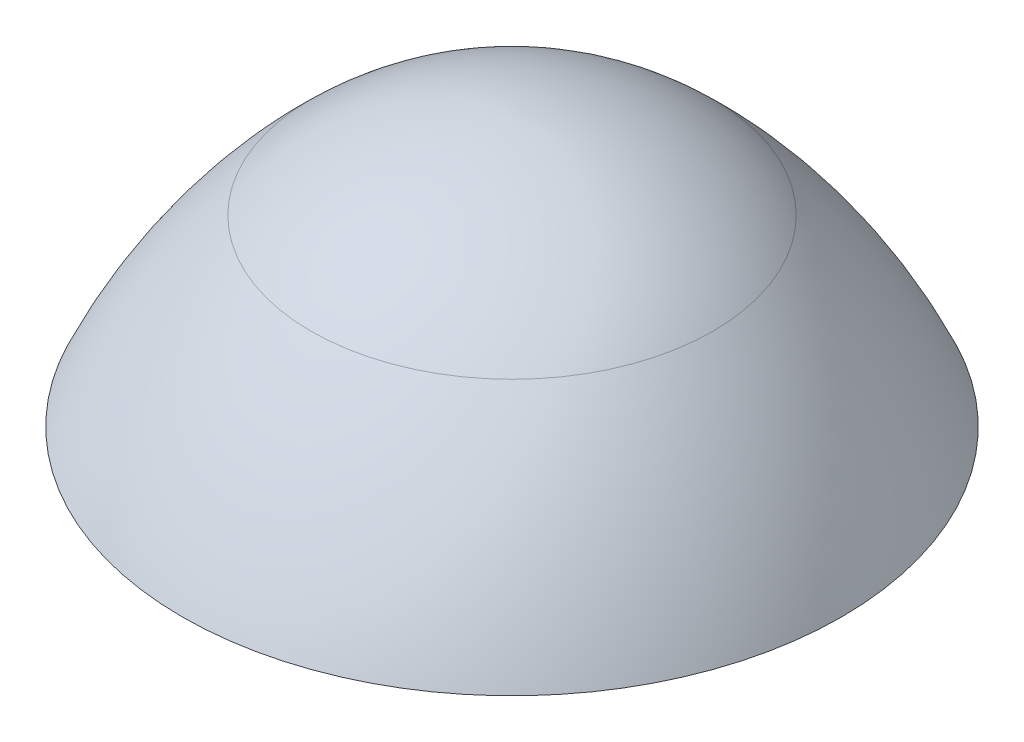
ISO-10303-21;
HEADER;
FILE_DESCRIPTION(('STEP AP214'),'2;1');
FILE_NAME('part.step','',(''),(''),'','','');
FILE_SCHEMA(('AUTOMOTIVE_DESIGN { 1 0 10303 214 1 1 1 1 }'));
ENDSEC;
DATA;
#1=APPLICATION_CONTEXT('core data for automotive mechanical design processes');
#2=APPLICATION_PROTOCOL_DEFINITION('international standard','automotive_design',2000,#1);
#3=PRODUCT_CONTEXT('',#1,'mechanical');
#4=PRODUCT('Part','Part','',(#3));
#5=PRODUCT_RELATED_PRODUCT_CATEGORY('part','',(#4));
#6=PRODUCT_DEFINITION_FORMATION('','',#4);
#7=PRODUCT_DEFINITION_CONTEXT('part definition',#1,'design');
#8=PRODUCT_DEFINITION('design','',#6,#7);
#9=PRODUCT_DEFINITION_SHAPE('','',#8);
#10=(LENGTH_UNIT() NAMED_UNIT(*) SI_UNIT(.MILLI.,.METRE.));
#11=(NAMED_UNIT(*) PLANE_ANGLE_UNIT() SI_UNIT($,.RADIAN.));
#12=(NAMED_UNIT(*) SI_UNIT($,.STERADIAN.) SOLID_ANGLE_UNIT());
#13=UNCERTAINTY_MEASURE_WITH_UNIT(LENGTH_MEASURE(1.E-05),#10,'distance_accuracy_value','');
#14=(GEOMETRIC_REPRESENTATION_CONTEXT(3) GLOBAL_UNCERTAINTY_ASSIGNED_CONTEXT((#13)) GLOBAL_UNIT_ASSIGNED_CONTEXT((#10,
#11,#12)) REPRESENTATION_CONTEXT('',''));
#15=CARTESIAN_POINT('',(0.,0.,0.));
#16=DIRECTION('',(0.,0.,1.));
#17=DIRECTION('',(1.,0.,0.));
#18=AXIS2_PLACEMENT_3D('',#15,#16,#17);
#19=CARTESIAN_POINT('',(0.,0.,0.));
#20=DIRECTION('',(0.,1.,0.));
#21=DIRECTION('',(0.,0.,1.));
#22=AXIS2_PLACEMENT_3D('',#19,#20,#21);
#23=PLANE('',#22);
#24=CARTESIAN_POINT('',(0.,0.,0.));
#25=DIRECTION('',(0.,1.,0.));
#26=DIRECTION('',(0.,0.,1.));
#27=AXIS2_PLACEMENT_3D('',#24,#25,#26);
#28=CIRCLE('',#27,2.6697594402432);
#29=CARTESIAN_POINT('',(0.,0.,2.6697594402432));
#30=VERTEX_POINT('',#29);
#31=EDGE_CURVE('E75',#30,#30,#28,.F.);
#32=ORIENTED_EDGE('',*,*,#31,.F.);
#33=EDGE_LOOP('',(#32));
#34=FACE_BOUND('',#33,.T.);
#35=CARTESIAN_POINT('',(0.,0.,0.));
#36=DIRECTION('',(0.,-1.,0.));
#37=DIRECTION('',(0.,0.,-1.));
#38=AXIS2_PLACEMENT_3D('',#35,#36,#37);
#39=CIRCLE('',#38,4.93);
#40=CARTESIAN_POINT('',(0.,0.,-4.93));
#41=VERTEX_POINT('',#40);
#42=EDGE_CURVE('E11',#41,#41,#39,.T.);
#43=ORIENTED_EDGE('',*,*,#42,.T.);
#44=EDGE_LOOP('',(#43));
#45=FACE_BOUND('',#44,.T.);
#46=ADVANCED_FACE('F39',(#34,#45),#23,.F.);
#47=CARTESIAN_POINT('',(0.,-3.57253502769833,0.));
#48=DIRECTION('',(0.,-1.,0.));
#49=DIRECTION('',(0.,0.,-1.));
#50=AXIS2_PLACEMENT_3D('',#47,#48,#49);
#51=DEGENERATE_TOROIDAL_SURFACE('',#50,3.05922144071723,8.75160932360143,.F.);
#52=ORIENTED_EDGE('',*,*,#42,.F.);
#53=EDGE_LOOP('',(#52));
#54=FACE_BOUND('',#53,.T.);
#55=CARTESIAN_POINT('',(0.,2.73733095112216,0.));
#56=DIRECTION('',(0.,-1.,0.));
#57=DIRECTION('',(0.,0.,-1.));
#58=AXIS2_PLACEMENT_3D('',#55,#56,#57);
#59=CIRCLE('',#58,3.00512164673018);
#60=CARTESIAN_POINT('',(0.,2.73733095112216,-3.00512164673018));
#61=VERTEX_POINT('',#60);
#62=EDGE_CURVE('E46',#61,#61,#59,.T.);
#63=ORIENTED_EDGE('',*,*,#62,.T.);
#64=EDGE_LOOP('',(#63));
#65=FACE_BOUND('',#64,.T.);
#66=ADVANCED_FACE('F66',(#54,#65),#51,.F.);
#67=CARTESIAN_POINT('',(0.,-0.530880535167795,0.135920619733875));
#68=DIRECTION('',(-1.,0.,0.));
#69=DIRECTION('',(0.,0.,-1.));
#70=AXIS2_PLACEMENT_3D('',#67,#68,#69);
#71=CIRCLE('',#70,4.53291879905555);
#72=TRIMMED_CURVE('',#71,(PARAMETER_VALUE(-1.54080660008017)),
(PARAMETER_VALUE(1.54080660008017)),.T.,.PARAMETER.);
#73=CARTESIAN_POINT('',(0.,-0.530880535167795,0.));
#74=DIRECTION('',(0.,-1.,0.));
#75=AXIS1_PLACEMENT('',#73,#74);
#76=SURFACE_OF_REVOLUTION('',#72,#75);
#77=ORIENTED_EDGE('',*,*,#62,.F.);
#78=EDGE_LOOP('',(#77));
#79=FACE_BOUND('',#78,.T.);
#80=CARTESIAN_POINT('',(0.,4.,0.));
#81=VERTEX_POINT('',#80);
#82=VERTEX_LOOP('',#81);
#83=FACE_BOUND('',#82,.T.);
#84=ADVANCED_FACE('F60',(#79,#83),#76,.T.);
#85=CARTESIAN_POINT('',(0.,-3.57253502769833,0.));
#86=DIRECTION('',(0.,-1.,0.));
#87=DIRECTION('',(0.,0.,-1.));
#88=AXIS2_PLACEMENT_3D('',#85,#86,#87);
#89=DEGENERATE_TOROIDAL_SURFACE('',#88,3.05922144071723,6.75160932360143,.F.);
#90=ORIENTED_EDGE('',*,*,#31,.T.);
#91=EDGE_LOOP('',(#90));
#92=FACE_BOUND('',#91,.T.);
#93=CARTESIAN_POINT('',(0.,1.29534108491459,0.));
#94=DIRECTION('',(0.,-1.,0.));
#95=DIRECTION('',(0.,0.,-1.));
#96=AXIS2_PLACEMENT_3D('',#93,#94,#95);
#97=CIRCLE('',#96,1.61924097879564);
#98=CARTESIAN_POINT('',(0.,1.29534108491459,-1.61924097879564));
#99=VERTEX_POINT('',#98);
#100=EDGE_CURVE('E81',#99,#99,#97,.T.);
#101=ORIENTED_EDGE('',*,*,#100,.F.);
#102=EDGE_LOOP('',(#101));
#103=FACE_BOUND('',#102,.T.);
#104=ADVANCED_FACE('F54',(#92,#103),#89,.T.);
#105=CARTESIAN_POINT('',(0.,-0.530880535167795,0.135920619733875));
#106=DIRECTION('',(-1.,0.,0.));
#107=DIRECTION('',(0.,0.,-1.));
#108=AXIS2_PLACEMENT_3D('',#105,#106,#107);
#109=CIRCLE('',#108,2.53291879905555);
#110=TRIMMED_CURVE('',#109,(PARAMETER_VALUE(-1.51710888261296)),
(PARAMETER_VALUE(1.51710888261296)),.T.,.PARAMETER.);
#111=CARTESIAN_POINT('',(0.,-0.530880535167795,0.));
#112=DIRECTION('',(0.,-1.,0.));
#113=AXIS1_PLACEMENT('',#111,#112);
#114=SURFACE_OF_REVOLUTION('',#110,#113);
#115=ORIENTED_EDGE('',*,*,#100,.T.);
#116=EDGE_LOOP('',(#115));
#117=FACE_BOUND('',#116,.T.);
#118=CARTESIAN_POINT('',(0.,1.99838877191285,0.));
#119=VERTEX_POINT('',#118);
#120=VERTEX_LOOP('',#119);
#121=FACE_BOUND('',#120,.T.);
#122=ADVANCED_FACE('F52',(#117,#121),#114,.F.);
#123=CLOSED_SHELL('',(#46,#66,#84,#104,#122));
#124=MANIFOLD_SOLID_BREP('B2',#123);
#125=ADVANCED_BREP_SHAPE_REPRESENTATION('',(#18,#124),#14);
#126=SHAPE_DEFINITION_REPRESENTATION(#9,#125);
ENDSEC;
END-ISO-10303-21;
